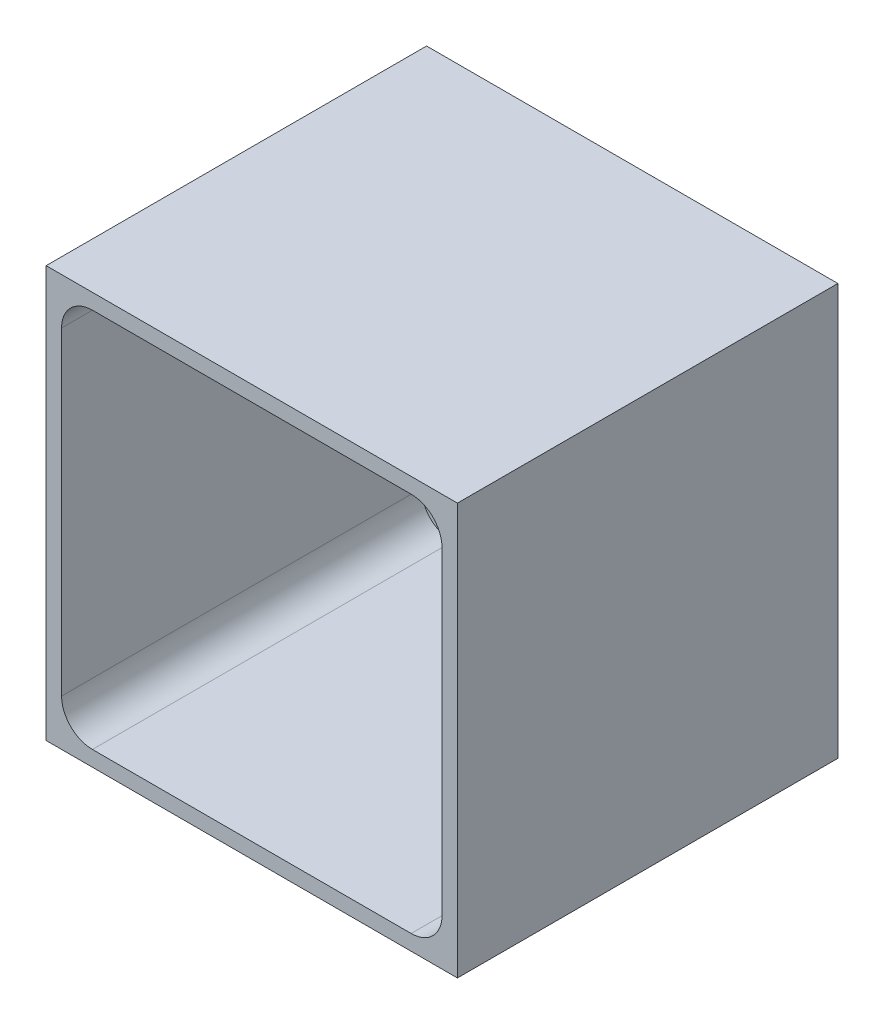
ISO-10303-21;
HEADER;
FILE_DESCRIPTION(('STEP AP214'),'2;1');
FILE_NAME('part.step','',(''),(''),'','','');
FILE_SCHEMA(('AUTOMOTIVE_DESIGN { 1 0 10303 214 1 1 1 1 }'));
ENDSEC;
DATA;
#1=APPLICATION_CONTEXT('core data for automotive mechanical design processes');
#2=APPLICATION_PROTOCOL_DEFINITION('international standard','automotive_design',2000,#1);
#3=PRODUCT_CONTEXT('',#1,'mechanical');
#4=PRODUCT('Part','Part','',(#3));
#5=PRODUCT_RELATED_PRODUCT_CATEGORY('part','',(#4));
#6=PRODUCT_DEFINITION_FORMATION('','',#4);
#7=PRODUCT_DEFINITION_CONTEXT('part definition',#1,'design');
#8=PRODUCT_DEFINITION('design','',#6,#7);
#9=PRODUCT_DEFINITION_SHAPE('','',#8);
#10=(LENGTH_UNIT() NAMED_UNIT(*) SI_UNIT(.MILLI.,.METRE.));
#11=(NAMED_UNIT(*) PLANE_ANGLE_UNIT() SI_UNIT($,.RADIAN.));
#12=(NAMED_UNIT(*) SI_UNIT($,.STERADIAN.) SOLID_ANGLE_UNIT());
#13=UNCERTAINTY_MEASURE_WITH_UNIT(LENGTH_MEASURE(1.E-05),#10,'distance_accuracy_value','');
#14=(GEOMETRIC_REPRESENTATION_CONTEXT(3) GLOBAL_UNCERTAINTY_ASSIGNED_CONTEXT((#13)) GLOBAL_UNIT_ASSIGNED_CONTEXT((#10,
#11,#12)) REPRESENTATION_CONTEXT('',''));
#15=CARTESIAN_POINT('',(0.,0.,0.));
#16=DIRECTION('',(0.,0.,1.));
#17=DIRECTION('',(1.,0.,0.));
#18=AXIS2_PLACEMENT_3D('',#15,#16,#17);
#19=CARTESIAN_POINT('',(0.,0.,35.));
#20=DIRECTION('',(0.,0.,-1.));
#21=DIRECTION('',(-1.,0.,0.));
#22=AXIS2_PLACEMENT_3D('',#19,#20,#21);
#23=PLANE('',#22);
#24=DIRECTION('',(-1.,0.,0.));
#25=VECTOR('',#24,1.);
#26=CARTESIAN_POINT('',(20.,20.,35.));
#27=LINE('',#26,#25);
#28=CARTESIAN_POINT('',(20.,20.,35.));
#29=VERTEX_POINT('',#28);
#30=CARTESIAN_POINT('',(-20.,20.,35.));
#31=VERTEX_POINT('',#30);
#32=EDGE_CURVE('E174',#29,#31,#27,.T.);
#33=ORIENTED_EDGE('',*,*,#32,.T.);
#34=DIRECTION('',(0.,-1.,0.));
#35=VECTOR('',#34,1.);
#36=CARTESIAN_POINT('',(-20.,-20.,35.));
#37=LINE('',#36,#35);
#38=CARTESIAN_POINT('',(-20.,-20.,35.));
#39=VERTEX_POINT('',#38);
#40=EDGE_CURVE('E136',#31,#39,#37,.T.);
#41=ORIENTED_EDGE('',*,*,#40,.T.);
#42=DIRECTION('',(1.,0.,0.));
#43=VECTOR('',#42,1.);
#44=CARTESIAN_POINT('',(20.,-20.,35.));
#45=LINE('',#44,#43);
#46=CARTESIAN_POINT('',(20.,-20.,35.));
#47=VERTEX_POINT('',#46);
#48=EDGE_CURVE('E187',#39,#47,#45,.T.);
#49=ORIENTED_EDGE('',*,*,#48,.T.);
#50=DIRECTION('',(0.,1.,0.));
#51=VECTOR('',#50,1.);
#52=CARTESIAN_POINT('',(20.,-20.,35.));
#53=LINE('',#52,#51);
#54=EDGE_CURVE('E189',#47,#29,#53,.T.);
#55=ORIENTED_EDGE('',*,*,#54,.T.);
#56=EDGE_LOOP('',(#33,#41,#49,#55));
#57=FACE_BOUND('',#56,.T.);
#58=DIRECTION('',(-1.,0.,0.));
#59=VECTOR('',#58,1.);
#60=CARTESIAN_POINT('',(18.5,18.5,35.));
#61=LINE('',#60,#59);
#62=CARTESIAN_POINT('',(15.5,18.5,35.));
#63=VERTEX_POINT('',#62);
#64=CARTESIAN_POINT('',(-15.5,18.5,35.));
#65=VERTEX_POINT('',#64);
#66=EDGE_CURVE('E162',#63,#65,#61,.T.);
#67=ORIENTED_EDGE('',*,*,#66,.F.);
#68=CARTESIAN_POINT('',(15.5,15.5,35.));
#69=DIRECTION('',(0.,0.,-1.));
#70=DIRECTION('',(-1.,0.,0.));
#71=AXIS2_PLACEMENT_3D('',#68,#69,#70);
#72=CIRCLE('',#71,3.);
#73=CARTESIAN_POINT('',(18.5,15.5,35.));
#74=VERTEX_POINT('',#73);
#75=EDGE_CURVE('E223',#63,#74,#72,.T.);
#76=ORIENTED_EDGE('',*,*,#75,.T.);
#77=DIRECTION('',(0.,1.,0.));
#78=VECTOR('',#77,1.);
#79=CARTESIAN_POINT('',(18.5,-18.5,35.));
#80=LINE('',#79,#78);
#81=CARTESIAN_POINT('',(18.5,-15.5,35.));
#82=VERTEX_POINT('',#81);
#83=EDGE_CURVE('E171',#82,#74,#80,.T.);
#84=ORIENTED_EDGE('',*,*,#83,.F.);
#85=CARTESIAN_POINT('',(15.5,-15.5,35.));
#86=DIRECTION('',(0.,0.,-1.));
#87=DIRECTION('',(-1.,0.,0.));
#88=AXIS2_PLACEMENT_3D('',#85,#86,#87);
#89=CIRCLE('',#88,3.);
#90=CARTESIAN_POINT('',(15.5,-18.5,35.));
#91=VERTEX_POINT('',#90);
#92=EDGE_CURVE('E11',#82,#91,#89,.T.);
#93=ORIENTED_EDGE('',*,*,#92,.T.);
#94=DIRECTION('',(1.,0.,0.));
#95=VECTOR('',#94,1.);
#96=CARTESIAN_POINT('',(18.5,-18.5,35.));
#97=LINE('',#96,#95);
#98=CARTESIAN_POINT('',(-15.5,-18.5,35.));
#99=VERTEX_POINT('',#98);
#100=EDGE_CURVE('E169',#99,#91,#97,.T.);
#101=ORIENTED_EDGE('',*,*,#100,.F.);
#102=CARTESIAN_POINT('',(-15.5,-15.5,35.));
#103=DIRECTION('',(0.,0.,-1.));
#104=DIRECTION('',(-1.,0.,0.));
#105=AXIS2_PLACEMENT_3D('',#102,#103,#104);
#106=CIRCLE('',#105,3.);
#107=CARTESIAN_POINT('',(-18.5,-15.5,35.));
#108=VERTEX_POINT('',#107);
#109=EDGE_CURVE('E49',#99,#108,#106,.T.);
#110=ORIENTED_EDGE('',*,*,#109,.T.);
#111=DIRECTION('',(0.,-1.,0.));
#112=VECTOR('',#111,1.);
#113=CARTESIAN_POINT('',(-18.5,-18.5,35.));
#114=LINE('',#113,#112);
#115=CARTESIAN_POINT('',(-18.5,15.5,35.));
#116=VERTEX_POINT('',#115);
#117=EDGE_CURVE('E165',#116,#108,#114,.T.);
#118=ORIENTED_EDGE('',*,*,#117,.F.);
#119=CARTESIAN_POINT('',(-15.5,15.5,35.));
#120=DIRECTION('',(0.,0.,-1.));
#121=DIRECTION('',(-1.,0.,0.));
#122=AXIS2_PLACEMENT_3D('',#119,#120,#121);
#123=CIRCLE('',#122,3.);
#124=EDGE_CURVE('E221',#116,#65,#123,.T.);
#125=ORIENTED_EDGE('',*,*,#124,.T.);
#126=EDGE_LOOP('',(#67,#76,#84,#93,#101,#110,#118,#125));
#127=FACE_BOUND('',#126,.T.);
#128=ADVANCED_FACE('F41',(#57,#127),#23,.F.);
#129=CARTESIAN_POINT('',(20.,20.,35.));
#130=DIRECTION('',(0.,-1.,0.));
#131=DIRECTION('',(0.,0.,-1.));
#132=AXIS2_PLACEMENT_3D('',#129,#130,#131);
#133=PLANE('',#132);
#134=DIRECTION('',(0.,0.,-1.));
#135=VECTOR('',#134,1.);
#136=CARTESIAN_POINT('',(20.,20.,35.));
#137=LINE('',#136,#135);
#138=CARTESIAN_POINT('',(20.,20.,-2.));
#139=VERTEX_POINT('',#138);
#140=EDGE_CURVE('E147',#29,#139,#137,.T.);
#141=ORIENTED_EDGE('',*,*,#140,.T.);
#142=DIRECTION('',(1.,0.,0.));
#143=VECTOR('',#142,1.);
#144=CARTESIAN_POINT('',(-20.,20.,-2.));
#145=LINE('',#144,#143);
#146=CARTESIAN_POINT('',(-20.,20.,-2.));
#147=VERTEX_POINT('',#146);
#148=EDGE_CURVE('E144',#147,#139,#145,.T.);
#149=ORIENTED_EDGE('',*,*,#148,.F.);
#150=DIRECTION('',(0.,0.,-1.));
#151=VECTOR('',#150,1.);
#152=CARTESIAN_POINT('',(-20.,20.,35.));
#153=LINE('',#152,#151);
#154=EDGE_CURVE('E130',#31,#147,#153,.T.);
#155=ORIENTED_EDGE('',*,*,#154,.F.);
#156=ORIENTED_EDGE('',*,*,#32,.F.);
#157=EDGE_LOOP('',(#141,#149,#155,#156));
#158=FACE_BOUND('',#157,.T.);
#159=ADVANCED_FACE('F145',(#158),#133,.F.);
#160=CARTESIAN_POINT('',(-20.,-20.,35.));
#161=DIRECTION('',(1.,0.,0.));
#162=DIRECTION('',(0.,0.,-1.));
#163=AXIS2_PLACEMENT_3D('',#160,#161,#162);
#164=PLANE('',#163);
#165=ORIENTED_EDGE('',*,*,#154,.T.);
#166=DIRECTION('',(0.,1.,0.));
#167=VECTOR('',#166,1.);
#168=CARTESIAN_POINT('',(-20.,-20.,-2.));
#169=LINE('',#168,#167);
#170=CARTESIAN_POINT('',(-20.,-20.,-2.));
#171=VERTEX_POINT('',#170);
#172=EDGE_CURVE('E135',#171,#147,#169,.T.);
#173=ORIENTED_EDGE('',*,*,#172,.F.);
#174=DIRECTION('',(0.,0.,-1.));
#175=VECTOR('',#174,1.);
#176=CARTESIAN_POINT('',(-20.,-20.,35.));
#177=LINE('',#176,#175);
#178=EDGE_CURVE('E141',#39,#171,#177,.T.);
#179=ORIENTED_EDGE('',*,*,#178,.F.);
#180=ORIENTED_EDGE('',*,*,#40,.F.);
#181=EDGE_LOOP('',(#165,#173,#179,#180));
#182=FACE_BOUND('',#181,.T.);
#183=ADVANCED_FACE('F132',(#182),#164,.F.);
#184=CARTESIAN_POINT('',(20.,-20.,35.));
#185=DIRECTION('',(0.,1.,0.));
#186=DIRECTION('',(0.,0.,1.));
#187=AXIS2_PLACEMENT_3D('',#184,#185,#186);
#188=PLANE('',#187);
#189=ORIENTED_EDGE('',*,*,#178,.T.);
#190=DIRECTION('',(-1.,0.,0.));
#191=VECTOR('',#190,1.);
#192=CARTESIAN_POINT('',(20.,-20.,-2.));
#193=LINE('',#192,#191);
#194=CARTESIAN_POINT('',(20.,-20.,-2.));
#195=VERTEX_POINT('',#194);
#196=EDGE_CURVE('E156',#195,#171,#193,.T.);
#197=ORIENTED_EDGE('',*,*,#196,.F.);
#198=DIRECTION('',(0.,0.,-1.));
#199=VECTOR('',#198,1.);
#200=CARTESIAN_POINT('',(20.,-20.,35.));
#201=LINE('',#200,#199);
#202=EDGE_CURVE('E192',#47,#195,#201,.T.);
#203=ORIENTED_EDGE('',*,*,#202,.F.);
#204=ORIENTED_EDGE('',*,*,#48,.F.);
#205=EDGE_LOOP('',(#189,#197,#203,#204));
#206=FACE_BOUND('',#205,.T.);
#207=ADVANCED_FACE('F278',(#206),#188,.F.);
#208=CARTESIAN_POINT('',(20.,-20.,35.));
#209=DIRECTION('',(-1.,0.,0.));
#210=DIRECTION('',(0.,0.,1.));
#211=AXIS2_PLACEMENT_3D('',#208,#209,#210);
#212=PLANE('',#211);
#213=ORIENTED_EDGE('',*,*,#202,.T.);
#214=DIRECTION('',(0.,-1.,0.));
#215=VECTOR('',#214,1.);
#216=CARTESIAN_POINT('',(20.,20.,-2.));
#217=LINE('',#216,#215);
#218=EDGE_CURVE('E151',#139,#195,#217,.T.);
#219=ORIENTED_EDGE('',*,*,#218,.F.);
#220=ORIENTED_EDGE('',*,*,#140,.F.);
#221=ORIENTED_EDGE('',*,*,#54,.F.);
#222=EDGE_LOOP('',(#213,#219,#220,#221));
#223=FACE_BOUND('',#222,.T.);
#224=ADVANCED_FACE('F275',(#223),#212,.F.);
#225=CARTESIAN_POINT('',(18.5,18.5,35.));
#226=DIRECTION('',(0.,-1.,0.));
#227=DIRECTION('',(0.,0.,-1.));
#228=AXIS2_PLACEMENT_3D('',#225,#226,#227);
#229=PLANE('',#228);
#230=ORIENTED_EDGE('',*,*,#66,.T.);
#231=DIRECTION('',(0.,0.,-1.));
#232=VECTOR('',#231,1.);
#233=CARTESIAN_POINT('',(-15.5,18.5,0.));
#234=LINE('',#233,#232);
#235=CARTESIAN_POINT('',(-15.5,18.5,0.));
#236=VERTEX_POINT('',#235);
#237=EDGE_CURVE('E196',#65,#236,#234,.T.);
#238=ORIENTED_EDGE('',*,*,#237,.T.);
#239=DIRECTION('',(-1.,0.,0.));
#240=VECTOR('',#239,1.);
#241=CARTESIAN_POINT('',(18.5,18.5,0.));
#242=LINE('',#241,#240);
#243=CARTESIAN_POINT('',(15.5,18.5,0.));
#244=VERTEX_POINT('',#243);
#245=EDGE_CURVE('E161',#244,#236,#242,.T.);
#246=ORIENTED_EDGE('',*,*,#245,.F.);
#247=DIRECTION('',(0.,0.,-1.));
#248=VECTOR('',#247,1.);
#249=CARTESIAN_POINT('',(15.5,18.5,35.));
#250=LINE('',#249,#248);
#251=EDGE_CURVE('E140',#244,#63,#250,.F.);
#252=ORIENTED_EDGE('',*,*,#251,.T.);
#253=EDGE_LOOP('',(#230,#238,#246,#252));
#254=FACE_BOUND('',#253,.T.);
#255=ADVANCED_FACE('F251',(#254),#229,.T.);
#256=CARTESIAN_POINT('',(-18.5,-18.5,35.));
#257=DIRECTION('',(1.,0.,0.));
#258=DIRECTION('',(0.,0.,-1.));
#259=AXIS2_PLACEMENT_3D('',#256,#257,#258);
#260=PLANE('',#259);
#261=DIRECTION('',(0.,-1.,0.));
#262=VECTOR('',#261,1.);
#263=CARTESIAN_POINT('',(-18.5,-18.5,0.));
#264=LINE('',#263,#262);
#265=CARTESIAN_POINT('',(-18.5,15.5,0.));
#266=VERTEX_POINT('',#265);
#267=CARTESIAN_POINT('',(-18.5,-15.5,0.));
#268=VERTEX_POINT('',#267);
#269=EDGE_CURVE('E177',#266,#268,#264,.T.);
#270=ORIENTED_EDGE('',*,*,#269,.F.);
#271=DIRECTION('',(0.,0.,-1.));
#272=VECTOR('',#271,1.);
#273=CARTESIAN_POINT('',(-18.5,15.5,35.));
#274=LINE('',#273,#272);
#275=EDGE_CURVE('E210',#266,#116,#274,.F.);
#276=ORIENTED_EDGE('',*,*,#275,.T.);
#277=ORIENTED_EDGE('',*,*,#117,.T.);
#278=DIRECTION('',(0.,0.,-1.));
#279=VECTOR('',#278,1.);
#280=CARTESIAN_POINT('',(-18.5,-15.5,0.));
#281=LINE('',#280,#279);
#282=EDGE_CURVE('E207',#108,#268,#281,.T.);
#283=ORIENTED_EDGE('',*,*,#282,.T.);
#284=EDGE_LOOP('',(#270,#276,#277,#283));
#285=FACE_BOUND('',#284,.T.);
#286=ADVANCED_FACE('F232',(#285),#260,.T.);
#287=CARTESIAN_POINT('',(18.5,-18.5,35.));
#288=DIRECTION('',(0.,1.,0.));
#289=DIRECTION('',(0.,0.,1.));
#290=AXIS2_PLACEMENT_3D('',#287,#288,#289);
#291=PLANE('',#290);
#292=DIRECTION('',(1.,0.,0.));
#293=VECTOR('',#292,1.);
#294=CARTESIAN_POINT('',(18.5,-18.5,0.));
#295=LINE('',#294,#293);
#296=CARTESIAN_POINT('',(-15.5,-18.5,0.));
#297=VERTEX_POINT('',#296);
#298=CARTESIAN_POINT('',(15.5,-18.5,0.));
#299=VERTEX_POINT('',#298);
#300=EDGE_CURVE('E180',#297,#299,#295,.T.);
#301=ORIENTED_EDGE('',*,*,#300,.F.);
#302=DIRECTION('',(0.,0.,-1.));
#303=VECTOR('',#302,1.);
#304=CARTESIAN_POINT('',(-15.5,-18.5,35.));
#305=LINE('',#304,#303);
#306=EDGE_CURVE('E61',#297,#99,#305,.F.);
#307=ORIENTED_EDGE('',*,*,#306,.T.);
#308=ORIENTED_EDGE('',*,*,#100,.T.);
#309=DIRECTION('',(0.,0.,-1.));
#310=VECTOR('',#309,1.);
#311=CARTESIAN_POINT('',(15.5,-18.5,0.));
#312=LINE('',#311,#310);
#313=EDGE_CURVE('E217',#91,#299,#312,.T.);
#314=ORIENTED_EDGE('',*,*,#313,.T.);
#315=EDGE_LOOP('',(#301,#307,#308,#314));
#316=FACE_BOUND('',#315,.T.);
#317=ADVANCED_FACE('F237',(#316),#291,.T.);
#318=CARTESIAN_POINT('',(18.5,-18.5,35.));
#319=DIRECTION('',(-1.,0.,0.));
#320=DIRECTION('',(0.,0.,1.));
#321=AXIS2_PLACEMENT_3D('',#318,#319,#320);
#322=PLANE('',#321);
#323=ORIENTED_EDGE('',*,*,#83,.T.);
#324=DIRECTION('',(0.,0.,-1.));
#325=VECTOR('',#324,1.);
#326=CARTESIAN_POINT('',(18.5,15.5,0.));
#327=LINE('',#326,#325);
#328=CARTESIAN_POINT('',(18.5,15.5,0.));
#329=VERTEX_POINT('',#328);
#330=EDGE_CURVE('E214',#74,#329,#327,.T.);
#331=ORIENTED_EDGE('',*,*,#330,.T.);
#332=DIRECTION('',(0.,1.,0.));
#333=VECTOR('',#332,1.);
#334=CARTESIAN_POINT('',(18.5,-18.5,0.));
#335=LINE('',#334,#333);
#336=CARTESIAN_POINT('',(18.5,-15.5,0.));
#337=VERTEX_POINT('',#336);
#338=EDGE_CURVE('E166',#337,#329,#335,.T.);
#339=ORIENTED_EDGE('',*,*,#338,.F.);
#340=DIRECTION('',(0.,0.,-1.));
#341=VECTOR('',#340,1.);
#342=CARTESIAN_POINT('',(18.5,-15.5,35.));
#343=LINE('',#342,#341);
#344=EDGE_CURVE('E212',#337,#82,#343,.F.);
#345=ORIENTED_EDGE('',*,*,#344,.T.);
#346=EDGE_LOOP('',(#323,#331,#339,#345));
#347=FACE_BOUND('',#346,.T.);
#348=ADVANCED_FACE('F243',(#347),#322,.T.);
#349=CARTESIAN_POINT('',(0.,0.,0.));
#350=DIRECTION('',(0.,0.,-1.));
#351=DIRECTION('',(-1.,0.,0.));
#352=AXIS2_PLACEMENT_3D('',#349,#350,#351);
#353=PLANE('',#352);
#354=ORIENTED_EDGE('',*,*,#245,.T.);
#355=CARTESIAN_POINT('',(-15.5,15.5,0.));
#356=DIRECTION('',(0.,0.,-1.));
#357=DIRECTION('',(-1.,0.,0.));
#358=AXIS2_PLACEMENT_3D('',#355,#356,#357);
#359=CIRCLE('',#358,3.);
#360=EDGE_CURVE('E205',#236,#266,#359,.F.);
#361=ORIENTED_EDGE('',*,*,#360,.T.);
#362=ORIENTED_EDGE('',*,*,#269,.T.);
#363=CARTESIAN_POINT('',(-15.5,-15.5,0.));
#364=DIRECTION('',(0.,0.,-1.));
#365=DIRECTION('',(-1.,0.,0.));
#366=AXIS2_PLACEMENT_3D('',#363,#364,#365);
#367=CIRCLE('',#366,3.);
#368=EDGE_CURVE('E201',#268,#297,#367,.F.);
#369=ORIENTED_EDGE('',*,*,#368,.T.);
#370=ORIENTED_EDGE('',*,*,#300,.T.);
#371=CARTESIAN_POINT('',(15.5,-15.5,0.));
#372=DIRECTION('',(0.,0.,-1.));
#373=DIRECTION('',(-1.,0.,0.));
#374=AXIS2_PLACEMENT_3D('',#371,#372,#373);
#375=CIRCLE('',#374,3.);
#376=EDGE_CURVE('E199',#299,#337,#375,.F.);
#377=ORIENTED_EDGE('',*,*,#376,.T.);
#378=ORIENTED_EDGE('',*,*,#338,.T.);
#379=CARTESIAN_POINT('',(15.5,15.5,0.));
#380=DIRECTION('',(0.,0.,-1.));
#381=DIRECTION('',(-1.,0.,0.));
#382=AXIS2_PLACEMENT_3D('',#379,#380,#381);
#383=CIRCLE('',#382,3.);
#384=EDGE_CURVE('E203',#329,#244,#383,.F.);
#385=ORIENTED_EDGE('',*,*,#384,.T.);
#386=EDGE_LOOP('',(#354,#361,#362,#369,#370,#377,#378,#385));
#387=FACE_BOUND('',#386,.T.);
#388=ADVANCED_FACE('F236',(#387),#353,.F.);
#389=CARTESIAN_POINT('',(0.,0.,-2.));
#390=DIRECTION('',(0.,0.,-1.));
#391=DIRECTION('',(-1.,0.,0.));
#392=AXIS2_PLACEMENT_3D('',#389,#390,#391);
#393=PLANE('',#392);
#394=ORIENTED_EDGE('',*,*,#172,.T.);
#395=ORIENTED_EDGE('',*,*,#148,.T.);
#396=ORIENTED_EDGE('',*,*,#218,.T.);
#397=ORIENTED_EDGE('',*,*,#196,.T.);
#398=EDGE_LOOP('',(#394,#395,#396,#397));
#399=FACE_BOUND('',#398,.T.);
#400=ADVANCED_FACE('F154',(#399),#393,.T.);
#401=CARTESIAN_POINT('',(-15.5,15.5,35.));
#402=DIRECTION('',(0.,0.,1.));
#403=DIRECTION('',(1.,0.,0.));
#404=AXIS2_PLACEMENT_3D('',#401,#402,#403);
#405=CYLINDRICAL_SURFACE('',#404,3.);
#406=ORIENTED_EDGE('',*,*,#124,.F.);
#407=ORIENTED_EDGE('',*,*,#275,.F.);
#408=ORIENTED_EDGE('',*,*,#360,.F.);
#409=ORIENTED_EDGE('',*,*,#237,.F.);
#410=EDGE_LOOP('',(#406,#407,#408,#409));
#411=FACE_BOUND('',#410,.T.);
#412=ADVANCED_FACE('F254',(#411),#405,.F.);
#413=CARTESIAN_POINT('',(15.5,15.5,35.));
#414=DIRECTION('',(0.,0.,1.));
#415=DIRECTION('',(1.,0.,0.));
#416=AXIS2_PLACEMENT_3D('',#413,#414,#415);
#417=CYLINDRICAL_SURFACE('',#416,3.);
#418=ORIENTED_EDGE('',*,*,#75,.F.);
#419=ORIENTED_EDGE('',*,*,#251,.F.);
#420=ORIENTED_EDGE('',*,*,#384,.F.);
#421=ORIENTED_EDGE('',*,*,#330,.F.);
#422=EDGE_LOOP('',(#418,#419,#420,#421));
#423=FACE_BOUND('',#422,.T.);
#424=ADVANCED_FACE('F247',(#423),#417,.F.);
#425=CARTESIAN_POINT('',(-15.5,-15.5,35.));
#426=DIRECTION('',(0.,0.,1.));
#427=DIRECTION('',(1.,0.,0.));
#428=AXIS2_PLACEMENT_3D('',#425,#426,#427);
#429=CYLINDRICAL_SURFACE('',#428,3.);
#430=ORIENTED_EDGE('',*,*,#109,.F.);
#431=ORIENTED_EDGE('',*,*,#306,.F.);
#432=ORIENTED_EDGE('',*,*,#368,.F.);
#433=ORIENTED_EDGE('',*,*,#282,.F.);
#434=EDGE_LOOP('',(#430,#431,#432,#433));
#435=FACE_BOUND('',#434,.T.);
#436=ADVANCED_FACE('F234',(#435),#429,.F.);
#437=CARTESIAN_POINT('',(15.5,-15.5,35.));
#438=DIRECTION('',(0.,0.,1.));
#439=DIRECTION('',(1.,0.,0.));
#440=AXIS2_PLACEMENT_3D('',#437,#438,#439);
#441=CYLINDRICAL_SURFACE('',#440,3.);
#442=ORIENTED_EDGE('',*,*,#92,.F.);
#443=ORIENTED_EDGE('',*,*,#344,.F.);
#444=ORIENTED_EDGE('',*,*,#376,.F.);
#445=ORIENTED_EDGE('',*,*,#313,.F.);
#446=EDGE_LOOP('',(#442,#443,#444,#445));
#447=FACE_BOUND('',#446,.T.);
#448=ADVANCED_FACE('F43',(#447),#441,.F.);
#449=CLOSED_SHELL('',(#128,#159,#183,#207,#224,#255,#286,#317,#348,#388,#400,#412,#424,#436,#448));
#450=MANIFOLD_SOLID_BREP('B2',#449);
#451=ADVANCED_BREP_SHAPE_REPRESENTATION('',(#18,#450),#14);
#452=SHAPE_DEFINITION_REPRESENTATION(#9,#451);
ENDSEC;
END-ISO-10303-21;
